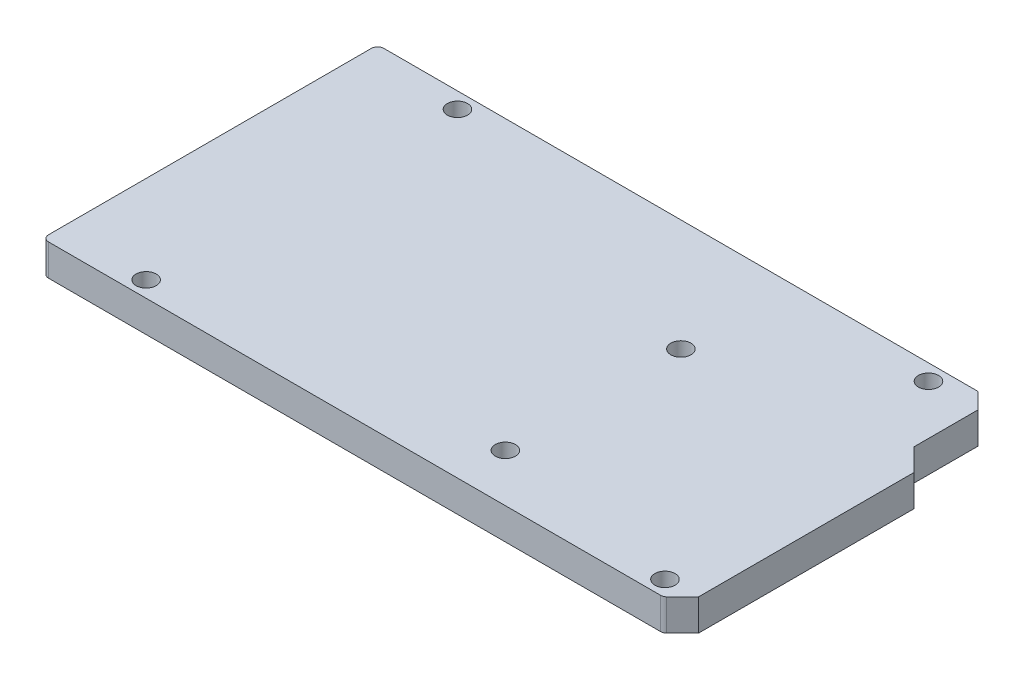
ISO-10303-21;
HEADER;
FILE_DESCRIPTION(('STEP AP214'),'2;1');
FILE_NAME('part.step','',(''),(''),'','','');
FILE_SCHEMA(('AUTOMOTIVE_DESIGN { 1 0 10303 214 1 1 1 1 }'));
ENDSEC;
DATA;
#1=APPLICATION_CONTEXT('core data for automotive mechanical design processes');
#2=APPLICATION_PROTOCOL_DEFINITION('international standard','automotive_design',2000,#1);
#3=PRODUCT_CONTEXT('',#1,'mechanical');
#4=PRODUCT('Part','Part','',(#3));
#5=PRODUCT_RELATED_PRODUCT_CATEGORY('part','',(#4));
#6=PRODUCT_DEFINITION_FORMATION('','',#4);
#7=PRODUCT_DEFINITION_CONTEXT('part definition',#1,'design');
#8=PRODUCT_DEFINITION('design','',#6,#7);
#9=PRODUCT_DEFINITION_SHAPE('','',#8);
#10=(LENGTH_UNIT() NAMED_UNIT(*) SI_UNIT(.MILLI.,.METRE.));
#11=(NAMED_UNIT(*) PLANE_ANGLE_UNIT() SI_UNIT($,.RADIAN.));
#12=(NAMED_UNIT(*) SI_UNIT($,.STERADIAN.) SOLID_ANGLE_UNIT());
#13=UNCERTAINTY_MEASURE_WITH_UNIT(LENGTH_MEASURE(1.E-05),#10,'distance_accuracy_value','');
#14=(GEOMETRIC_REPRESENTATION_CONTEXT(3) GLOBAL_UNCERTAINTY_ASSIGNED_CONTEXT((#13)) GLOBAL_UNIT_ASSIGNED_CONTEXT((#10,
#11,#12)) REPRESENTATION_CONTEXT('',''));
#15=CARTESIAN_POINT('',(0.,0.,0.));
#16=DIRECTION('',(0.,0.,1.));
#17=DIRECTION('',(1.,0.,0.));
#18=AXIS2_PLACEMENT_3D('',#15,#16,#17);
#19=CARTESIAN_POINT('',(-50.76,5.,26.65));
#20=DIRECTION('',(0.,0.,-1.));
#21=DIRECTION('',(-1.,0.,0.));
#22=AXIS2_PLACEMENT_3D('',#19,#20,#21);
#23=PLANE('',#22);
#24=DIRECTION('',(1.,0.,0.));
#25=VECTOR('',#24,1.);
#26=CARTESIAN_POINT('',(-50.76,0.,26.65));
#27=LINE('',#26,#25);
#28=CARTESIAN_POINT('',(-49.766,0.,26.65));
#29=VERTEX_POINT('',#28);
#30=CARTESIAN_POINT('',(47.5325619127329,0.,26.65));
#31=VERTEX_POINT('',#30);
#32=EDGE_CURVE('E258',#29,#31,#27,.T.);
#33=ORIENTED_EDGE('',*,*,#32,.T.);
#34=DIRECTION('',(0.,-1.,0.));
#35=VECTOR('',#34,1.);
#36=CARTESIAN_POINT('',(47.5325619127329,5.,26.65));
#37=LINE('',#36,#35);
#38=CARTESIAN_POINT('',(47.5325619127329,5.,26.65));
#39=VERTEX_POINT('',#38);
#40=EDGE_CURVE('E171',#31,#39,#37,.F.);
#41=ORIENTED_EDGE('',*,*,#40,.T.);
#42=DIRECTION('',(1.,0.,0.));
#43=VECTOR('',#42,1.);
#44=CARTESIAN_POINT('',(-50.76,5.,26.65));
#45=LINE('',#44,#43);
#46=CARTESIAN_POINT('',(-49.766,5.,26.65));
#47=VERTEX_POINT('',#46);
#48=EDGE_CURVE('E131',#47,#39,#45,.T.);
#49=ORIENTED_EDGE('',*,*,#48,.F.);
#50=DIRECTION('',(0.,-1.,0.));
#51=VECTOR('',#50,1.);
#52=CARTESIAN_POINT('',(-49.766,5.,26.65));
#53=LINE('',#52,#51);
#54=EDGE_CURVE('E167',#47,#29,#53,.T.);
#55=ORIENTED_EDGE('',*,*,#54,.T.);
#56=EDGE_LOOP('',(#33,#41,#49,#55));
#57=FACE_BOUND('',#56,.T.);
#58=ADVANCED_FACE('F42',(#57),#23,.F.);
#59=CARTESIAN_POINT('',(50.76,5.,23.834));
#60=DIRECTION('',(-0.707106781186553,0.,-0.707106781186542));
#61=DIRECTION('',(-0.707106781186542,0.,0.707106781186553));
#62=AXIS2_PLACEMENT_3D('',#59,#60,#61);
#63=PLANE('',#62);
#64=DIRECTION('',(0.707106781186542,0.,-0.707106781186553));
#65=VECTOR('',#64,1.);
#66=CARTESIAN_POINT('',(50.76,0.,23.834));
#67=LINE('',#66,#65);
#68=CARTESIAN_POINT('',(48.221,0.,26.373));
#69=VERTEX_POINT('',#68);
#70=CARTESIAN_POINT('',(50.76,0.,23.834));
#71=VERTEX_POINT('',#70);
#72=EDGE_CURVE('E234',#69,#71,#67,.T.);
#73=ORIENTED_EDGE('',*,*,#72,.T.);
#74=DIRECTION('',(0.,-1.,0.));
#75=VECTOR('',#74,1.);
#76=CARTESIAN_POINT('',(50.76,5.,23.834));
#77=LINE('',#76,#75);
#78=CARTESIAN_POINT('',(50.76,5.,23.834));
#79=VERTEX_POINT('',#78);
#80=EDGE_CURVE('E145',#79,#71,#77,.T.);
#81=ORIENTED_EDGE('',*,*,#80,.F.);
#82=DIRECTION('',(0.707106781186542,0.,-0.707106781186553));
#83=VECTOR('',#82,1.);
#84=CARTESIAN_POINT('',(50.76,5.,23.834));
#85=LINE('',#84,#83);
#86=CARTESIAN_POINT('',(48.221,5.,26.373));
#87=VERTEX_POINT('',#86);
#88=EDGE_CURVE('E128',#87,#79,#85,.T.);
#89=ORIENTED_EDGE('',*,*,#88,.F.);
#90=DIRECTION('',(0.,-1.,0.));
#91=VECTOR('',#90,1.);
#92=CARTESIAN_POINT('',(48.221,5.,26.373));
#93=LINE('',#92,#91);
#94=EDGE_CURVE('E142',#87,#69,#93,.T.);
#95=ORIENTED_EDGE('',*,*,#94,.T.);
#96=EDGE_LOOP('',(#73,#81,#89,#95));
#97=FACE_BOUND('',#96,.T.);
#98=ADVANCED_FACE('F141',(#97),#63,.F.);
#99=CARTESIAN_POINT('',(50.76,5.,-10.423));
#100=DIRECTION('',(-1.,0.,0.));
#101=DIRECTION('',(0.,0.,1.));
#102=AXIS2_PLACEMENT_3D('',#99,#100,#101);
#103=PLANE('',#102);
#104=DIRECTION('',(0.,0.,-1.));
#105=VECTOR('',#104,1.);
#106=CARTESIAN_POINT('',(50.76,0.,-10.423));
#107=LINE('',#106,#105);
#108=CARTESIAN_POINT('',(50.76,0.,-10.423));
#109=VERTEX_POINT('',#108);
#110=EDGE_CURVE('E226',#71,#109,#107,.T.);
#111=ORIENTED_EDGE('',*,*,#110,.T.);
#112=DIRECTION('',(0.,-1.,0.));
#113=VECTOR('',#112,1.);
#114=CARTESIAN_POINT('',(50.76,5.,-10.423));
#115=LINE('',#114,#113);
#116=CARTESIAN_POINT('',(50.76,5.,-10.423));
#117=VERTEX_POINT('',#116);
#118=EDGE_CURVE('E159',#117,#109,#115,.T.);
#119=ORIENTED_EDGE('',*,*,#118,.F.);
#120=DIRECTION('',(0.,0.,-1.));
#121=VECTOR('',#120,1.);
#122=CARTESIAN_POINT('',(50.76,5.,-10.423));
#123=LINE('',#122,#121);
#124=EDGE_CURVE('E148',#79,#117,#123,.T.);
#125=ORIENTED_EDGE('',*,*,#124,.F.);
#126=ORIENTED_EDGE('',*,*,#80,.T.);
#127=EDGE_LOOP('',(#111,#119,#125,#126));
#128=FACE_BOUND('',#127,.T.);
#129=ADVANCED_FACE('F263',(#128),#103,.F.);
#130=CARTESIAN_POINT('',(47.228,5.,-13.955));
#131=DIRECTION('',(-0.707106781186546,0.,0.707106781186549));
#132=DIRECTION('',(0.707106781186549,0.,0.707106781186546));
#133=AXIS2_PLACEMENT_3D('',#130,#131,#132);
#134=PLANE('',#133);
#135=DIRECTION('',(-0.707106781186549,0.,-0.707106781186546));
#136=VECTOR('',#135,1.);
#137=CARTESIAN_POINT('',(47.228,0.,-13.955));
#138=LINE('',#137,#136);
#139=CARTESIAN_POINT('',(47.228,0.,-13.955));
#140=VERTEX_POINT('',#139);
#141=EDGE_CURVE('E221',#109,#140,#138,.T.);
#142=ORIENTED_EDGE('',*,*,#141,.T.);
#143=DIRECTION('',(0.,-1.,0.));
#144=VECTOR('',#143,1.);
#145=CARTESIAN_POINT('',(47.228,5.,-13.955));
#146=LINE('',#145,#144);
#147=CARTESIAN_POINT('',(47.228,5.,-13.955));
#148=VERTEX_POINT('',#147);
#149=EDGE_CURVE('E210',#148,#140,#146,.T.);
#150=ORIENTED_EDGE('',*,*,#149,.F.);
#151=DIRECTION('',(-0.707106781186549,0.,-0.707106781186546));
#152=VECTOR('',#151,1.);
#153=CARTESIAN_POINT('',(47.228,5.,-13.955));
#154=LINE('',#153,#152);
#155=EDGE_CURVE('E222',#117,#148,#154,.T.);
#156=ORIENTED_EDGE('',*,*,#155,.F.);
#157=ORIENTED_EDGE('',*,*,#118,.T.);
#158=EDGE_LOOP('',(#142,#150,#156,#157));
#159=FACE_BOUND('',#158,.T.);
#160=ADVANCED_FACE('F219',(#159),#134,.F.);
#161=CARTESIAN_POINT('',(47.228,5.,-24.111));
#162=DIRECTION('',(-1.,0.,0.));
#163=DIRECTION('',(0.,0.,1.));
#164=AXIS2_PLACEMENT_3D('',#161,#162,#163);
#165=PLANE('',#164);
#166=DIRECTION('',(0.,0.,-1.));
#167=VECTOR('',#166,1.);
#168=CARTESIAN_POINT('',(47.228,0.,-24.111));
#169=LINE('',#168,#167);
#170=CARTESIAN_POINT('',(47.228,0.,-24.111));
#171=VERTEX_POINT('',#170);
#172=EDGE_CURVE('E228',#140,#171,#169,.T.);
#173=ORIENTED_EDGE('',*,*,#172,.T.);
#174=DIRECTION('',(0.,-1.,0.));
#175=VECTOR('',#174,1.);
#176=CARTESIAN_POINT('',(47.228,5.,-24.111));
#177=LINE('',#176,#175);
#178=CARTESIAN_POINT('',(47.228,5.,-24.111));
#179=VERTEX_POINT('',#178);
#180=EDGE_CURVE('E206',#179,#171,#177,.T.);
#181=ORIENTED_EDGE('',*,*,#180,.F.);
#182=DIRECTION('',(0.,0.,-1.));
#183=VECTOR('',#182,1.);
#184=CARTESIAN_POINT('',(47.228,5.,-24.111));
#185=LINE('',#184,#183);
#186=EDGE_CURVE('E254',#148,#179,#185,.T.);
#187=ORIENTED_EDGE('',*,*,#186,.F.);
#188=ORIENTED_EDGE('',*,*,#149,.T.);
#189=EDGE_LOOP('',(#173,#181,#187,#188));
#190=FACE_BOUND('',#189,.T.);
#191=ADVANCED_FACE('F271',(#190),#165,.F.);
#192=CARTESIAN_POINT('',(44.689,5.,-26.65));
#193=DIRECTION('',(-0.707106781186548,0.,0.707106781186546));
#194=DIRECTION('',(0.707106781186547,0.,0.707106781186549));
#195=AXIS2_PLACEMENT_3D('',#192,#193,#194);
#196=PLANE('',#195);
#197=DIRECTION('',(-0.707106781186546,0.,-0.707106781186548));
#198=VECTOR('',#197,1.);
#199=CARTESIAN_POINT('',(44.689,0.,-26.65));
#200=LINE('',#199,#198);
#201=CARTESIAN_POINT('',(44.689,0.,-26.65));
#202=VERTEX_POINT('',#201);
#203=EDGE_CURVE('E198',#171,#202,#200,.T.);
#204=ORIENTED_EDGE('',*,*,#203,.T.);
#205=DIRECTION('',(0.,-1.,0.));
#206=VECTOR('',#205,1.);
#207=CARTESIAN_POINT('',(44.689,5.,-26.65));
#208=LINE('',#207,#206);
#209=CARTESIAN_POINT('',(44.689,5.,-26.65));
#210=VERTEX_POINT('',#209);
#211=EDGE_CURVE('E202',#210,#202,#208,.T.);
#212=ORIENTED_EDGE('',*,*,#211,.F.);
#213=DIRECTION('',(-0.707106781186546,0.,-0.707106781186548));
#214=VECTOR('',#213,1.);
#215=CARTESIAN_POINT('',(44.689,5.,-26.65));
#216=LINE('',#215,#214);
#217=EDGE_CURVE('E249',#179,#210,#216,.T.);
#218=ORIENTED_EDGE('',*,*,#217,.F.);
#219=ORIENTED_EDGE('',*,*,#180,.T.);
#220=EDGE_LOOP('',(#204,#212,#218,#219));
#221=FACE_BOUND('',#220,.T.);
#222=ADVANCED_FACE('F240',(#221),#196,.F.);
#223=CARTESIAN_POINT('',(-50.76,5.,-26.65));
#224=DIRECTION('',(0.,0.,1.));
#225=DIRECTION('',(1.,0.,0.));
#226=AXIS2_PLACEMENT_3D('',#223,#224,#225);
#227=PLANE('',#226);
#228=DIRECTION('',(-1.,0.,0.));
#229=VECTOR('',#228,1.);
#230=CARTESIAN_POINT('',(-50.76,0.,-26.65));
#231=LINE('',#230,#229);
#232=CARTESIAN_POINT('',(-49.766,0.,-26.65));
#233=VERTEX_POINT('',#232);
#234=EDGE_CURVE('E193',#202,#233,#231,.T.);
#235=ORIENTED_EDGE('',*,*,#234,.T.);
#236=DIRECTION('',(0.,-1.,0.));
#237=VECTOR('',#236,1.);
#238=CARTESIAN_POINT('',(-49.766,5.,-26.65));
#239=LINE('',#238,#237);
#240=CARTESIAN_POINT('',(-49.766,5.,-26.65));
#241=VERTEX_POINT('',#240);
#242=EDGE_CURVE('E11',#233,#241,#239,.F.);
#243=ORIENTED_EDGE('',*,*,#242,.T.);
#244=DIRECTION('',(-1.,0.,0.));
#245=VECTOR('',#244,1.);
#246=CARTESIAN_POINT('',(-50.76,5.,-26.65));
#247=LINE('',#246,#245);
#248=EDGE_CURVE('E247',#210,#241,#247,.T.);
#249=ORIENTED_EDGE('',*,*,#248,.F.);
#250=ORIENTED_EDGE('',*,*,#211,.T.);
#251=EDGE_LOOP('',(#235,#243,#249,#250));
#252=FACE_BOUND('',#251,.T.);
#253=ADVANCED_FACE('F245',(#252),#227,.F.);
#254=CARTESIAN_POINT('',(-50.76,5.,26.65));
#255=DIRECTION('',(1.,0.,0.));
#256=DIRECTION('',(0.,0.,-1.));
#257=AXIS2_PLACEMENT_3D('',#254,#255,#256);
#258=PLANE('',#257);
#259=DIRECTION('',(0.,0.,1.));
#260=VECTOR('',#259,1.);
#261=CARTESIAN_POINT('',(-50.76,0.,26.65));
#262=LINE('',#261,#260);
#263=CARTESIAN_POINT('',(-50.76,0.,-25.656));
#264=VERTEX_POINT('',#263);
#265=CARTESIAN_POINT('',(-50.76,0.,25.656));
#266=VERTEX_POINT('',#265);
#267=EDGE_CURVE('E184',#264,#266,#262,.T.);
#268=ORIENTED_EDGE('',*,*,#267,.T.);
#269=DIRECTION('',(0.,-1.,0.));
#270=VECTOR('',#269,1.);
#271=CARTESIAN_POINT('',(-50.76,5.,25.656));
#272=LINE('',#271,#270);
#273=CARTESIAN_POINT('',(-50.76,5.,25.656));
#274=VERTEX_POINT('',#273);
#275=EDGE_CURVE('E51',#266,#274,#272,.F.);
#276=ORIENTED_EDGE('',*,*,#275,.T.);
#277=DIRECTION('',(0.,0.,1.));
#278=VECTOR('',#277,1.);
#279=CARTESIAN_POINT('',(-50.76,5.,26.65));
#280=LINE('',#279,#278);
#281=CARTESIAN_POINT('',(-50.76,5.,-25.656));
#282=VERTEX_POINT('',#281);
#283=EDGE_CURVE('E185',#282,#274,#280,.T.);
#284=ORIENTED_EDGE('',*,*,#283,.F.);
#285=DIRECTION('',(0.,-1.,0.));
#286=VECTOR('',#285,1.);
#287=CARTESIAN_POINT('',(-50.76,5.,-25.656));
#288=LINE('',#287,#286);
#289=EDGE_CURVE('E136',#282,#264,#288,.T.);
#290=ORIENTED_EDGE('',*,*,#289,.T.);
#291=EDGE_LOOP('',(#268,#276,#284,#290));
#292=FACE_BOUND('',#291,.T.);
#293=ADVANCED_FACE('F183',(#292),#258,.F.);
#294=CARTESIAN_POINT('',(0.,5.,0.));
#295=DIRECTION('',(0.,-1.,0.));
#296=DIRECTION('',(0.,0.,-1.));
#297=AXIS2_PLACEMENT_3D('',#294,#295,#296);
#298=PLANE('',#297);
#299=CARTESIAN_POINT('',(45.684,5.,24.111));
#300=DIRECTION('',(0.,1.,0.));
#301=DIRECTION('',(0.,0.,1.));
#302=AXIS2_PLACEMENT_3D('',#299,#300,#301);
#303=CIRCLE('',#302,1.608);
#304=CARTESIAN_POINT('',(45.684,5.,25.719));
#305=VERTEX_POINT('',#304);
#306=EDGE_CURVE('E482',#305,#305,#303,.T.);
#307=ORIENTED_EDGE('',*,*,#306,.F.);
#308=EDGE_LOOP('',(#307));
#309=FACE_BOUND('',#308,.T.);
#310=CARTESIAN_POINT('',(-36.795,5.,24.111));
#311=DIRECTION('',(0.,1.,0.));
#312=DIRECTION('',(0.,0.,1.));
#313=AXIS2_PLACEMENT_3D('',#310,#311,#312);
#314=CIRCLE('',#313,1.608);
#315=CARTESIAN_POINT('',(-36.795,5.,25.719));
#316=VERTEX_POINT('',#315);
#317=EDGE_CURVE('E510',#316,#316,#314,.T.);
#318=ORIENTED_EDGE('',*,*,#317,.F.);
#319=EDGE_LOOP('',(#318));
#320=FACE_BOUND('',#319,.T.);
#321=CARTESIAN_POINT('',(15.235,5.,-8.87599999999999));
#322=DIRECTION('',(0.,1.,0.));
#323=DIRECTION('',(0.,0.,1.));
#324=AXIS2_PLACEMENT_3D('',#321,#322,#323);
#325=CIRCLE('',#324,1.608);
#326=CARTESIAN_POINT('',(15.235,5.,-7.268));
#327=VERTEX_POINT('',#326);
#328=EDGE_CURVE('E496',#327,#327,#325,.T.);
#329=ORIENTED_EDGE('',*,*,#328,.F.);
#330=EDGE_LOOP('',(#329));
#331=FACE_BOUND('',#330,.T.);
#332=CARTESIAN_POINT('',(15.235,5.,19.033));
#333=DIRECTION('',(0.,1.,0.));
#334=DIRECTION('',(0.,0.,1.));
#335=AXIS2_PLACEMENT_3D('',#332,#333,#334);
#336=CIRCLE('',#335,1.608);
#337=CARTESIAN_POINT('',(15.235,5.,20.641));
#338=VERTEX_POINT('',#337);
#339=EDGE_CURVE('E529',#338,#338,#336,.T.);
#340=ORIENTED_EDGE('',*,*,#339,.F.);
#341=EDGE_LOOP('',(#340));
#342=FACE_BOUND('',#341,.T.);
#343=CARTESIAN_POINT('',(39.357,5.,-24.111));
#344=DIRECTION('',(0.,1.,0.));
#345=DIRECTION('',(0.,0.,1.));
#346=AXIS2_PLACEMENT_3D('',#343,#344,#345);
#347=CIRCLE('',#346,1.608);
#348=CARTESIAN_POINT('',(39.357,5.,-22.503));
#349=VERTEX_POINT('',#348);
#350=EDGE_CURVE('E487',#349,#349,#347,.T.);
#351=ORIENTED_EDGE('',*,*,#350,.F.);
#352=EDGE_LOOP('',(#351));
#353=FACE_BOUND('',#352,.T.);
#354=CARTESIAN_POINT('',(-35.525,5.,-24.111));
#355=DIRECTION('',(0.,1.,0.));
#356=DIRECTION('',(0.,0.,1.));
#357=AXIS2_PLACEMENT_3D('',#354,#355,#356);
#358=CIRCLE('',#357,1.608);
#359=CARTESIAN_POINT('',(-35.525,5.,-22.503));
#360=VERTEX_POINT('',#359);
#361=EDGE_CURVE('E261',#360,#360,#358,.T.);
#362=ORIENTED_EDGE('',*,*,#361,.F.);
#363=EDGE_LOOP('',(#362));
#364=FACE_BOUND('',#363,.T.);
#365=ORIENTED_EDGE('',*,*,#48,.T.);
#366=CARTESIAN_POINT('',(47.5325619127329,5.,25.656));
#367=DIRECTION('',(0.,-1.,0.));
#368=DIRECTION('',(0.,0.,-1.));
#369=AXIS2_PLACEMENT_3D('',#366,#367,#368);
#370=CIRCLE('',#369,0.994);
#371=EDGE_CURVE('E125',#39,#87,#370,.F.);
#372=ORIENTED_EDGE('',*,*,#371,.T.);
#373=ORIENTED_EDGE('',*,*,#88,.T.);
#374=ORIENTED_EDGE('',*,*,#124,.T.);
#375=ORIENTED_EDGE('',*,*,#155,.T.);
#376=ORIENTED_EDGE('',*,*,#186,.T.);
#377=ORIENTED_EDGE('',*,*,#217,.T.);
#378=ORIENTED_EDGE('',*,*,#248,.T.);
#379=CARTESIAN_POINT('',(-49.766,5.,-25.656));
#380=DIRECTION('',(0.,-1.,0.));
#381=DIRECTION('',(0.,0.,-1.));
#382=AXIS2_PLACEMENT_3D('',#379,#380,#381);
#383=CIRCLE('',#382,0.994);
#384=EDGE_CURVE('E64',#241,#282,#383,.F.);
#385=ORIENTED_EDGE('',*,*,#384,.T.);
#386=ORIENTED_EDGE('',*,*,#283,.T.);
#387=CARTESIAN_POINT('',(-49.766,5.,25.656));
#388=DIRECTION('',(0.,-1.,0.));
#389=DIRECTION('',(0.,0.,-1.));
#390=AXIS2_PLACEMENT_3D('',#387,#388,#389);
#391=CIRCLE('',#390,0.994);
#392=EDGE_CURVE('E137',#274,#47,#391,.F.);
#393=ORIENTED_EDGE('',*,*,#392,.T.);
#394=EDGE_LOOP('',(#365,#372,#373,#374,#375,#376,#377,#378,#385,#386,#393));
#395=FACE_BOUND('',#394,.T.);
#396=ADVANCED_FACE('F127',(#309,#320,#331,#342,#353,#364,#395),#298,.F.);
#397=CARTESIAN_POINT('',(0.,0.,0.));
#398=DIRECTION('',(0.,-1.,0.));
#399=DIRECTION('',(0.,0.,-1.));
#400=AXIS2_PLACEMENT_3D('',#397,#398,#399);
#401=PLANE('',#400);
#402=CARTESIAN_POINT('',(45.684,0.,24.111));
#403=DIRECTION('',(0.,1.,0.));
#404=DIRECTION('',(0.,0.,1.));
#405=AXIS2_PLACEMENT_3D('',#402,#403,#404);
#406=CIRCLE('',#405,1.608);
#407=CARTESIAN_POINT('',(45.684,0.,25.719));
#408=VERTEX_POINT('',#407);
#409=EDGE_CURVE('E485',#408,#408,#406,.T.);
#410=ORIENTED_EDGE('',*,*,#409,.T.);
#411=EDGE_LOOP('',(#410));
#412=FACE_BOUND('',#411,.T.);
#413=CARTESIAN_POINT('',(-36.795,0.,24.111));
#414=DIRECTION('',(0.,1.,0.));
#415=DIRECTION('',(0.,0.,1.));
#416=AXIS2_PLACEMENT_3D('',#413,#414,#415);
#417=CIRCLE('',#416,1.608);
#418=CARTESIAN_POINT('',(-36.795,0.,25.719));
#419=VERTEX_POINT('',#418);
#420=EDGE_CURVE('E505',#419,#419,#417,.T.);
#421=ORIENTED_EDGE('',*,*,#420,.T.);
#422=EDGE_LOOP('',(#421));
#423=FACE_BOUND('',#422,.T.);
#424=CARTESIAN_POINT('',(15.235,0.,-8.87599999999999));
#425=DIRECTION('',(0.,1.,0.));
#426=DIRECTION('',(0.,0.,1.));
#427=AXIS2_PLACEMENT_3D('',#424,#425,#426);
#428=CIRCLE('',#427,1.608);
#429=CARTESIAN_POINT('',(15.235,0.,-7.268));
#430=VERTEX_POINT('',#429);
#431=EDGE_CURVE('E516',#430,#430,#428,.T.);
#432=ORIENTED_EDGE('',*,*,#431,.T.);
#433=EDGE_LOOP('',(#432));
#434=FACE_BOUND('',#433,.T.);
#435=CARTESIAN_POINT('',(15.235,0.,19.033));
#436=DIRECTION('',(0.,1.,0.));
#437=DIRECTION('',(0.,0.,1.));
#438=AXIS2_PLACEMENT_3D('',#435,#436,#437);
#439=CIRCLE('',#438,1.608);
#440=CARTESIAN_POINT('',(15.235,0.,20.641));
#441=VERTEX_POINT('',#440);
#442=EDGE_CURVE('E525',#441,#441,#439,.T.);
#443=ORIENTED_EDGE('',*,*,#442,.T.);
#444=EDGE_LOOP('',(#443));
#445=FACE_BOUND('',#444,.T.);
#446=CARTESIAN_POINT('',(39.357,0.,-24.111));
#447=DIRECTION('',(0.,1.,0.));
#448=DIRECTION('',(0.,0.,1.));
#449=AXIS2_PLACEMENT_3D('',#446,#447,#448);
#450=CIRCLE('',#449,1.608);
#451=CARTESIAN_POINT('',(39.357,0.,-22.503));
#452=VERTEX_POINT('',#451);
#453=EDGE_CURVE('E492',#452,#452,#450,.T.);
#454=ORIENTED_EDGE('',*,*,#453,.T.);
#455=EDGE_LOOP('',(#454));
#456=FACE_BOUND('',#455,.T.);
#457=CARTESIAN_POINT('',(-35.525,0.,-24.111));
#458=DIRECTION('',(0.,1.,0.));
#459=DIRECTION('',(0.,0.,1.));
#460=AXIS2_PLACEMENT_3D('',#457,#458,#459);
#461=CIRCLE('',#460,1.608);
#462=CARTESIAN_POINT('',(-35.525,0.,-22.503));
#463=VERTEX_POINT('',#462);
#464=EDGE_CURVE('E502',#463,#463,#461,.T.);
#465=ORIENTED_EDGE('',*,*,#464,.T.);
#466=EDGE_LOOP('',(#465));
#467=FACE_BOUND('',#466,.T.);
#468=ORIENTED_EDGE('',*,*,#72,.F.);
#469=CARTESIAN_POINT('',(47.5325619127329,0.,25.656));
#470=DIRECTION('',(0.,-1.,0.));
#471=DIRECTION('',(0.,0.,-1.));
#472=AXIS2_PLACEMENT_3D('',#469,#470,#471);
#473=CIRCLE('',#472,0.994);
#474=EDGE_CURVE('E151',#69,#31,#473,.T.);
#475=ORIENTED_EDGE('',*,*,#474,.T.);
#476=ORIENTED_EDGE('',*,*,#32,.F.);
#477=CARTESIAN_POINT('',(-49.766,0.,25.656));
#478=DIRECTION('',(0.,-1.,0.));
#479=DIRECTION('',(0.,0.,-1.));
#480=AXIS2_PLACEMENT_3D('',#477,#478,#479);
#481=CIRCLE('',#480,0.994);
#482=EDGE_CURVE('E157',#29,#266,#481,.T.);
#483=ORIENTED_EDGE('',*,*,#482,.T.);
#484=ORIENTED_EDGE('',*,*,#267,.F.);
#485=CARTESIAN_POINT('',(-49.766,0.,-25.656));
#486=DIRECTION('',(0.,-1.,0.));
#487=DIRECTION('',(0.,0.,-1.));
#488=AXIS2_PLACEMENT_3D('',#485,#486,#487);
#489=CIRCLE('',#488,0.994);
#490=EDGE_CURVE('E153',#264,#233,#489,.T.);
#491=ORIENTED_EDGE('',*,*,#490,.T.);
#492=ORIENTED_EDGE('',*,*,#234,.F.);
#493=ORIENTED_EDGE('',*,*,#203,.F.);
#494=ORIENTED_EDGE('',*,*,#172,.F.);
#495=ORIENTED_EDGE('',*,*,#141,.F.);
#496=ORIENTED_EDGE('',*,*,#110,.F.);
#497=EDGE_LOOP('',(#468,#475,#476,#483,#484,#491,#492,#493,#494,#495,#496));
#498=FACE_BOUND('',#497,.T.);
#499=ADVANCED_FACE('F188',(#412,#423,#434,#445,#456,#467,#498),#401,.T.);
#500=CARTESIAN_POINT('',(-35.525,5.,-24.111));
#501=DIRECTION('',(0.,-1.,0.));
#502=DIRECTION('',(0.,0.,-1.));
#503=AXIS2_PLACEMENT_3D('',#500,#501,#502);
#504=CYLINDRICAL_SURFACE('',#503,1.608);
#505=ORIENTED_EDGE('',*,*,#361,.T.);
#506=EDGE_LOOP('',(#505));
#507=FACE_BOUND('',#506,.T.);
#508=ORIENTED_EDGE('',*,*,#464,.F.);
#509=EDGE_LOOP('',(#508));
#510=FACE_BOUND('',#509,.T.);
#511=ADVANCED_FACE('F325',(#507,#510),#504,.F.);
#512=CARTESIAN_POINT('',(39.357,5.,-24.111));
#513=DIRECTION('',(0.,-1.,0.));
#514=DIRECTION('',(0.,0.,-1.));
#515=AXIS2_PLACEMENT_3D('',#512,#513,#514);
#516=CYLINDRICAL_SURFACE('',#515,1.608);
#517=ORIENTED_EDGE('',*,*,#350,.T.);
#518=EDGE_LOOP('',(#517));
#519=FACE_BOUND('',#518,.T.);
#520=ORIENTED_EDGE('',*,*,#453,.F.);
#521=EDGE_LOOP('',(#520));
#522=FACE_BOUND('',#521,.T.);
#523=ADVANCED_FACE('F386',(#519,#522),#516,.F.);
#524=CARTESIAN_POINT('',(15.235,5.,19.033));
#525=DIRECTION('',(0.,-1.,0.));
#526=DIRECTION('',(0.,0.,-1.));
#527=AXIS2_PLACEMENT_3D('',#524,#525,#526);
#528=CYLINDRICAL_SURFACE('',#527,1.608);
#529=ORIENTED_EDGE('',*,*,#339,.T.);
#530=EDGE_LOOP('',(#529));
#531=FACE_BOUND('',#530,.T.);
#532=ORIENTED_EDGE('',*,*,#442,.F.);
#533=EDGE_LOOP('',(#532));
#534=FACE_BOUND('',#533,.T.);
#535=ADVANCED_FACE('F397',(#531,#534),#528,.F.);
#536=CARTESIAN_POINT('',(15.235,5.,-8.87599999999999));
#537=DIRECTION('',(0.,-1.,0.));
#538=DIRECTION('',(0.,0.,-1.));
#539=AXIS2_PLACEMENT_3D('',#536,#537,#538);
#540=CYLINDRICAL_SURFACE('',#539,1.608);
#541=ORIENTED_EDGE('',*,*,#328,.T.);
#542=EDGE_LOOP('',(#541));
#543=FACE_BOUND('',#542,.T.);
#544=ORIENTED_EDGE('',*,*,#431,.F.);
#545=EDGE_LOOP('',(#544));
#546=FACE_BOUND('',#545,.T.);
#547=ADVANCED_FACE('F408',(#543,#546),#540,.F.);
#548=CARTESIAN_POINT('',(-36.795,5.,24.111));
#549=DIRECTION('',(0.,-1.,0.));
#550=DIRECTION('',(0.,0.,-1.));
#551=AXIS2_PLACEMENT_3D('',#548,#549,#550);
#552=CYLINDRICAL_SURFACE('',#551,1.608);
#553=ORIENTED_EDGE('',*,*,#317,.T.);
#554=EDGE_LOOP('',(#553));
#555=FACE_BOUND('',#554,.T.);
#556=ORIENTED_EDGE('',*,*,#420,.F.);
#557=EDGE_LOOP('',(#556));
#558=FACE_BOUND('',#557,.T.);
#559=ADVANCED_FACE('F419',(#555,#558),#552,.F.);
#560=CARTESIAN_POINT('',(45.684,5.,24.111));
#561=DIRECTION('',(0.,-1.,0.));
#562=DIRECTION('',(0.,0.,-1.));
#563=AXIS2_PLACEMENT_3D('',#560,#561,#562);
#564=CYLINDRICAL_SURFACE('',#563,1.608);
#565=ORIENTED_EDGE('',*,*,#306,.T.);
#566=EDGE_LOOP('',(#565));
#567=FACE_BOUND('',#566,.T.);
#568=ORIENTED_EDGE('',*,*,#409,.F.);
#569=EDGE_LOOP('',(#568));
#570=FACE_BOUND('',#569,.T.);
#571=ADVANCED_FACE('F292',(#567,#570),#564,.F.);
#572=CARTESIAN_POINT('',(47.5325619127329,5.,25.656));
#573=DIRECTION('',(0.,-1.,0.));
#574=DIRECTION('',(0.,0.,-1.));
#575=AXIS2_PLACEMENT_3D('',#572,#573,#574);
#576=CYLINDRICAL_SURFACE('',#575,0.994);
#577=ORIENTED_EDGE('',*,*,#371,.F.);
#578=ORIENTED_EDGE('',*,*,#40,.F.);
#579=ORIENTED_EDGE('',*,*,#474,.F.);
#580=ORIENTED_EDGE('',*,*,#94,.F.);
#581=EDGE_LOOP('',(#577,#578,#579,#580));
#582=FACE_BOUND('',#581,.T.);
#583=ADVANCED_FACE('F150',(#582),#576,.T.);
#584=CARTESIAN_POINT('',(-49.766,5.,25.656));
#585=DIRECTION('',(0.,-1.,0.));
#586=DIRECTION('',(0.,0.,-1.));
#587=AXIS2_PLACEMENT_3D('',#584,#585,#586);
#588=CYLINDRICAL_SURFACE('',#587,0.994);
#589=ORIENTED_EDGE('',*,*,#392,.F.);
#590=ORIENTED_EDGE('',*,*,#275,.F.);
#591=ORIENTED_EDGE('',*,*,#482,.F.);
#592=ORIENTED_EDGE('',*,*,#54,.F.);
#593=EDGE_LOOP('',(#589,#590,#591,#592));
#594=FACE_BOUND('',#593,.T.);
#595=ADVANCED_FACE('F291',(#594),#588,.T.);
#596=CARTESIAN_POINT('',(-49.766,5.,-25.656));
#597=DIRECTION('',(0.,-1.,0.));
#598=DIRECTION('',(0.,0.,-1.));
#599=AXIS2_PLACEMENT_3D('',#596,#597,#598);
#600=CYLINDRICAL_SURFACE('',#599,0.994);
#601=ORIENTED_EDGE('',*,*,#384,.F.);
#602=ORIENTED_EDGE('',*,*,#242,.F.);
#603=ORIENTED_EDGE('',*,*,#490,.F.);
#604=ORIENTED_EDGE('',*,*,#289,.F.);
#605=EDGE_LOOP('',(#601,#602,#603,#604));
#606=FACE_BOUND('',#605,.T.);
#607=ADVANCED_FACE('F44',(#606),#600,.T.);
#608=CLOSED_SHELL('',(#58,#98,#129,#160,#191,#222,#253,#293,#396,#499,#511,#523,#535,#547,#559,
#571,#583,#595,#607));
#609=MANIFOLD_SOLID_BREP('B2',#608);
#610=ADVANCED_BREP_SHAPE_REPRESENTATION('',(#18,#609),#14);
#611=SHAPE_DEFINITION_REPRESENTATION(#9,#610);
ENDSEC;
END-ISO-10303-21;
